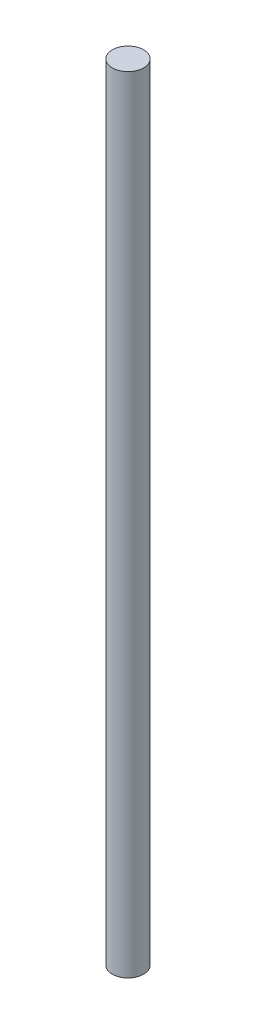
ISO-10303-21;
HEADER;
FILE_DESCRIPTION(('STEP AP214'),'2;1');
FILE_NAME('part.step','',(''),(''),'','','');
FILE_SCHEMA(('AUTOMOTIVE_DESIGN { 1 0 10303 214 1 1 1 1 }'));
ENDSEC;
DATA;
#1=APPLICATION_CONTEXT('core data for automotive mechanical design processes');
#2=APPLICATION_PROTOCOL_DEFINITION('international standard','automotive_design',2000,#1);
#3=PRODUCT_CONTEXT('',#1,'mechanical');
#4=PRODUCT('Part','Part','',(#3));
#5=PRODUCT_RELATED_PRODUCT_CATEGORY('part','',(#4));
#6=PRODUCT_DEFINITION_FORMATION('','',#4);
#7=PRODUCT_DEFINITION_CONTEXT('part definition',#1,'design');
#8=PRODUCT_DEFINITION('design','',#6,#7);
#9=PRODUCT_DEFINITION_SHAPE('','',#8);
#10=(LENGTH_UNIT() NAMED_UNIT(*) SI_UNIT(.MILLI.,.METRE.));
#11=(NAMED_UNIT(*) PLANE_ANGLE_UNIT() SI_UNIT($,.RADIAN.));
#12=(NAMED_UNIT(*) SI_UNIT($,.STERADIAN.) SOLID_ANGLE_UNIT());
#13=UNCERTAINTY_MEASURE_WITH_UNIT(LENGTH_MEASURE(1.E-05),#10,'distance_accuracy_value','');
#14=(GEOMETRIC_REPRESENTATION_CONTEXT(3) GLOBAL_UNCERTAINTY_ASSIGNED_CONTEXT((#13)) GLOBAL_UNIT_ASSIGNED_CONTEXT((#10,
#11,#12)) REPRESENTATION_CONTEXT('',''));
#15=CARTESIAN_POINT('',(0.,0.,0.));
#16=DIRECTION('',(0.,0.,1.));
#17=DIRECTION('',(1.,0.,0.));
#18=AXIS2_PLACEMENT_3D('',#15,#16,#17);
#19=CARTESIAN_POINT('',(0.,1000.,0.));
#20=DIRECTION('',(0.,-1.,0.));
#21=DIRECTION('',(0.,0.,-1.));
#22=AXIS2_PLACEMENT_3D('',#19,#20,#21);
#23=CYLINDRICAL_SURFACE('',#22,20.);
#24=CARTESIAN_POINT('',(0.,1000.,0.));
#25=DIRECTION('',(0.,1.,0.));
#26=DIRECTION('',(0.,0.,1.));
#27=AXIS2_PLACEMENT_3D('',#24,#25,#26);
#28=CIRCLE('',#27,20.);
#29=CARTESIAN_POINT('',(0.,1000.,20.));
#30=VERTEX_POINT('',#29);
#31=EDGE_CURVE('E10',#30,#30,#28,.T.);
#32=ORIENTED_EDGE('',*,*,#31,.F.);
#33=EDGE_LOOP('',(#32));
#34=FACE_BOUND('',#33,.T.);
#35=CARTESIAN_POINT('',(0.,0.,0.));
#36=DIRECTION('',(0.,1.,0.));
#37=DIRECTION('',(0.,0.,1.));
#38=AXIS2_PLACEMENT_3D('',#35,#36,#37);
#39=CIRCLE('',#38,20.);
#40=CARTESIAN_POINT('',(0.,0.,20.));
#41=VERTEX_POINT('',#40);
#42=EDGE_CURVE('E38',#41,#41,#39,.T.);
#43=ORIENTED_EDGE('',*,*,#42,.T.);
#44=EDGE_LOOP('',(#43));
#45=FACE_BOUND('',#44,.T.);
#46=ADVANCED_FACE('F35',(#34,#45),#23,.T.);
#47=CARTESIAN_POINT('',(0.,1000.,0.));
#48=DIRECTION('',(0.,1.,0.));
#49=DIRECTION('',(0.,0.,1.));
#50=AXIS2_PLACEMENT_3D('',#47,#48,#49);
#51=PLANE('',#50);
#52=ORIENTED_EDGE('',*,*,#31,.T.);
#53=EDGE_LOOP('',(#52));
#54=FACE_BOUND('',#53,.T.);
#55=ADVANCED_FACE('F50',(#54),#51,.T.);
#56=CARTESIAN_POINT('',(0.,0.,0.));
#57=DIRECTION('',(0.,1.,0.));
#58=DIRECTION('',(0.,0.,1.));
#59=AXIS2_PLACEMENT_3D('',#56,#57,#58);
#60=PLANE('',#59);
#61=ORIENTED_EDGE('',*,*,#42,.F.);
#62=EDGE_LOOP('',(#61));
#63=FACE_BOUND('',#62,.T.);
#64=ADVANCED_FACE('F48',(#63),#60,.F.);
#65=CLOSED_SHELL('',(#46,#55,#64));
#66=MANIFOLD_SOLID_BREP('B2',#65);
#67=ADVANCED_BREP_SHAPE_REPRESENTATION('',(#18,#66),#14);
#68=SHAPE_DEFINITION_REPRESENTATION(#9,#67);
ENDSEC;
END-ISO-10303-21;
